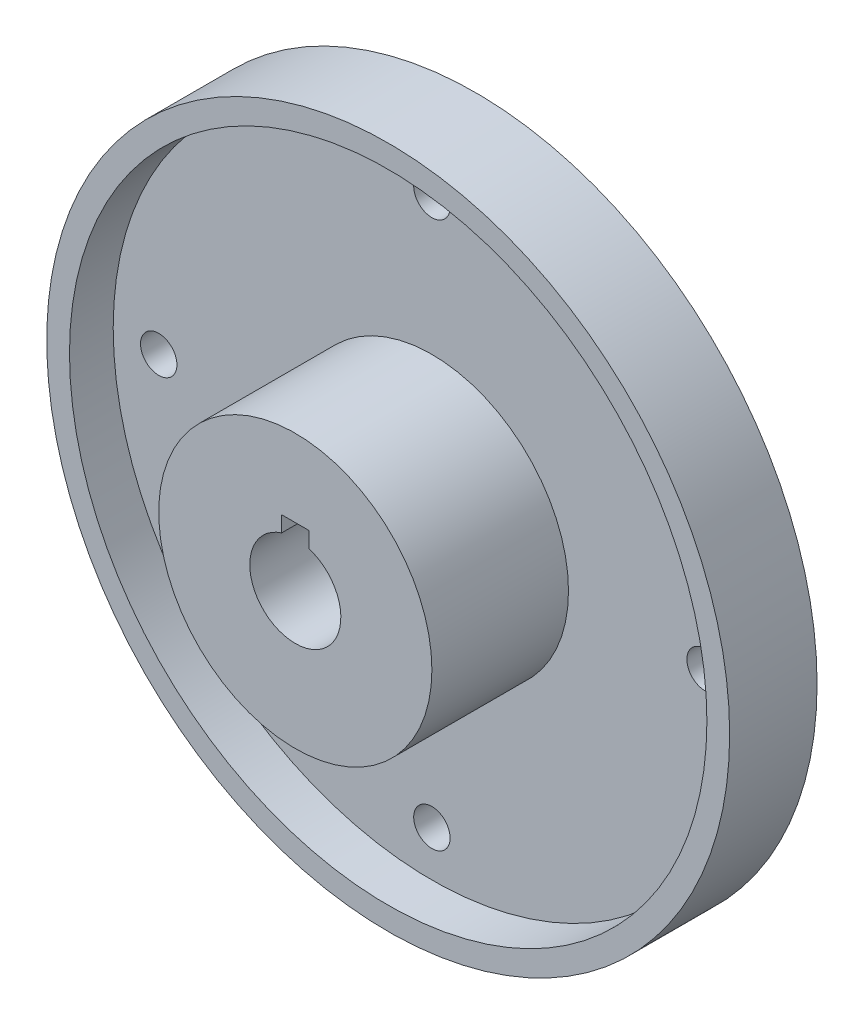
ISO-10303-21;
HEADER;
FILE_DESCRIPTION(('STEP AP214'),'2;1');
FILE_NAME('part.step','',(''),(''),'','','');
FILE_SCHEMA(('AUTOMOTIVE_DESIGN { 1 0 10303 214 1 1 1 1 }'));
ENDSEC;
DATA;
#1=APPLICATION_CONTEXT('core data for automotive mechanical design processes');
#2=APPLICATION_PROTOCOL_DEFINITION('international standard','automotive_design',2000,#1);
#3=PRODUCT_CONTEXT('',#1,'mechanical');
#4=PRODUCT('Part','Part','',(#3));
#5=PRODUCT_RELATED_PRODUCT_CATEGORY('part','',(#4));
#6=PRODUCT_DEFINITION_FORMATION('','',#4);
#7=PRODUCT_DEFINITION_CONTEXT('part definition',#1,'design');
#8=PRODUCT_DEFINITION('design','',#6,#7);
#9=PRODUCT_DEFINITION_SHAPE('','',#8);
#10=(LENGTH_UNIT() NAMED_UNIT(*) SI_UNIT(.MILLI.,.METRE.));
#11=(NAMED_UNIT(*) PLANE_ANGLE_UNIT() SI_UNIT($,.RADIAN.));
#12=(NAMED_UNIT(*) SI_UNIT($,.STERADIAN.) SOLID_ANGLE_UNIT());
#13=UNCERTAINTY_MEASURE_WITH_UNIT(LENGTH_MEASURE(1.E-05),#10,'distance_accuracy_value','');
#14=(GEOMETRIC_REPRESENTATION_CONTEXT(3) GLOBAL_UNCERTAINTY_ASSIGNED_CONTEXT((#13)) GLOBAL_UNIT_ASSIGNED_CONTEXT((#10,
#11,#12)) REPRESENTATION_CONTEXT('',''));
#15=CARTESIAN_POINT('',(0.,0.,0.));
#16=DIRECTION('',(0.,0.,1.));
#17=DIRECTION('',(1.,0.,0.));
#18=AXIS2_PLACEMENT_3D('',#15,#16,#17);
#19=CARTESIAN_POINT('',(0.,0.,19.2));
#20=DIRECTION('',(0.,0.,-1.));
#21=DIRECTION('',(-1.,0.,0.));
#22=AXIS2_PLACEMENT_3D('',#19,#20,#21);
#23=CYLINDRICAL_SURFACE('',#22,75.);
#24=CARTESIAN_POINT('',(0.,0.,19.2));
#25=DIRECTION('',(0.,0.,1.));
#26=DIRECTION('',(1.,0.,0.));
#27=AXIS2_PLACEMENT_3D('',#24,#25,#26);
#28=CIRCLE('',#27,75.);
#29=CARTESIAN_POINT('',(75.,0.,19.2));
#30=VERTEX_POINT('',#29);
#31=EDGE_CURVE('E177',#30,#30,#28,.T.);
#32=ORIENTED_EDGE('',*,*,#31,.F.);
#33=EDGE_LOOP('',(#32));
#34=FACE_BOUND('',#33,.T.);
#35=CARTESIAN_POINT('',(0.,0.,0.));
#36=DIRECTION('',(0.,0.,1.));
#37=DIRECTION('',(1.,0.,0.));
#38=AXIS2_PLACEMENT_3D('',#35,#36,#37);
#39=CIRCLE('',#38,75.);
#40=CARTESIAN_POINT('',(75.,0.,0.));
#41=VERTEX_POINT('',#40);
#42=EDGE_CURVE('E173',#41,#41,#39,.T.);
#43=ORIENTED_EDGE('',*,*,#42,.T.);
#44=EDGE_LOOP('',(#43));
#45=FACE_BOUND('',#44,.T.);
#46=ADVANCED_FACE('F45',(#34,#45),#23,.T.);
#47=CARTESIAN_POINT('',(0.,0.,19.2));
#48=DIRECTION('',(0.,0.,1.));
#49=DIRECTION('',(1.,0.,0.));
#50=AXIS2_PLACEMENT_3D('',#47,#48,#49);
#51=PLANE('',#50);
#52=CARTESIAN_POINT('',(0.,0.,19.2));
#53=DIRECTION('',(0.,0.,1.));
#54=DIRECTION('',(1.,0.,0.));
#55=AXIS2_PLACEMENT_3D('',#52,#53,#54);
#56=CIRCLE('',#55,70.);
#57=CARTESIAN_POINT('',(70.,0.,19.2));
#58=VERTEX_POINT('',#57);
#59=EDGE_CURVE('E165',#58,#58,#56,.T.);
#60=ORIENTED_EDGE('',*,*,#59,.F.);
#61=EDGE_LOOP('',(#60));
#62=FACE_BOUND('',#61,.T.);
#63=ORIENTED_EDGE('',*,*,#31,.T.);
#64=EDGE_LOOP('',(#63));
#65=FACE_BOUND('',#64,.T.);
#66=ADVANCED_FACE('F213',(#62,#65),#51,.T.);
#67=CARTESIAN_POINT('',(0.,0.,0.));
#68=DIRECTION('',(0.,0.,1.));
#69=DIRECTION('',(1.,0.,0.));
#70=AXIS2_PLACEMENT_3D('',#67,#68,#69);
#71=PLANE('',#70);
#72=CARTESIAN_POINT('',(0.,0.,0.));
#73=DIRECTION('',(0.,0.,1.));
#74=DIRECTION('',(1.,0.,0.));
#75=AXIS2_PLACEMENT_3D('',#72,#73,#74);
#76=CIRCLE('',#75,10.);
#77=CARTESIAN_POINT('',(-3.,9.53939201416946,0.));
#78=VERTEX_POINT('',#77);
#79=CARTESIAN_POINT('',(3.,9.53939201416946,0.));
#80=VERTEX_POINT('',#79);
#81=EDGE_CURVE('E107',#78,#80,#76,.T.);
#82=ORIENTED_EDGE('',*,*,#81,.T.);
#83=DIRECTION('',(0.,1.,0.));
#84=VECTOR('',#83,1.);
#85=CARTESIAN_POINT('',(3.,13.,0.));
#86=LINE('',#85,#84);
#87=CARTESIAN_POINT('',(3.,13.,0.));
#88=VERTEX_POINT('',#87);
#89=EDGE_CURVE('E87',#80,#88,#86,.T.);
#90=ORIENTED_EDGE('',*,*,#89,.T.);
#91=DIRECTION('',(-1.,0.,0.));
#92=VECTOR('',#91,1.);
#93=CARTESIAN_POINT('',(-3.,13.,0.));
#94=LINE('',#93,#92);
#95=CARTESIAN_POINT('',(-3.,13.,0.));
#96=VERTEX_POINT('',#95);
#97=EDGE_CURVE('E98',#88,#96,#94,.T.);
#98=ORIENTED_EDGE('',*,*,#97,.T.);
#99=DIRECTION('',(0.,-1.,0.));
#100=VECTOR('',#99,1.);
#101=CARTESIAN_POINT('',(-3.,13.,0.));
#102=LINE('',#101,#100);
#103=EDGE_CURVE('E95',#96,#78,#102,.T.);
#104=ORIENTED_EDGE('',*,*,#103,.T.);
#105=EDGE_LOOP('',(#82,#90,#98,#104));
#106=FACE_BOUND('',#105,.T.);
#107=CARTESIAN_POINT('',(0.,60.,0.));
#108=DIRECTION('',(0.,0.,1.));
#109=DIRECTION('',(1.,0.,0.));
#110=AXIS2_PLACEMENT_3D('',#107,#108,#109);
#111=CIRCLE('',#110,4.);
#112=CARTESIAN_POINT('',(4.,60.,0.));
#113=VERTEX_POINT('',#112);
#114=EDGE_CURVE('E150',#113,#113,#111,.T.);
#115=ORIENTED_EDGE('',*,*,#114,.T.);
#116=EDGE_LOOP('',(#115));
#117=FACE_BOUND('',#116,.T.);
#118=CARTESIAN_POINT('',(60.0000000000017,1.69428074463191E-12,0.));
#119=DIRECTION('',(0.,0.,1.));
#120=DIRECTION('',(1.,0.,0.));
#121=AXIS2_PLACEMENT_3D('',#118,#119,#120);
#122=CIRCLE('',#121,4.00000000000132);
#123=CARTESIAN_POINT('',(64.000000000003,1.69428074463191E-12,0.));
#124=VERTEX_POINT('',#123);
#125=EDGE_CURVE('E146',#124,#124,#122,.T.);
#126=ORIENTED_EDGE('',*,*,#125,.T.);
#127=EDGE_LOOP('',(#126));
#128=FACE_BOUND('',#127,.T.);
#129=CARTESIAN_POINT('',(3.38856148926383E-12,-60.,0.));
#130=DIRECTION('',(0.,0.,1.));
#131=DIRECTION('',(1.,0.,0.));
#132=AXIS2_PLACEMENT_3D('',#129,#130,#131);
#133=CIRCLE('',#132,4.00000000000364);
#134=CARTESIAN_POINT('',(4.00000000000703,-60.,0.));
#135=VERTEX_POINT('',#134);
#136=EDGE_CURVE('E142',#135,#135,#133,.T.);
#137=ORIENTED_EDGE('',*,*,#136,.T.);
#138=EDGE_LOOP('',(#137));
#139=FACE_BOUND('',#138,.T.);
#140=CARTESIAN_POINT('',(-59.9999999999983,-1.7016286254268E-12,0.));
#141=DIRECTION('',(0.,0.,1.));
#142=DIRECTION('',(1.,0.,0.));
#143=AXIS2_PLACEMENT_3D('',#140,#141,#142);
#144=CIRCLE('',#143,4.00000000000272);
#145=CARTESIAN_POINT('',(-55.9999999999956,-1.7016286254268E-12,0.));
#146=VERTEX_POINT('',#145);
#147=EDGE_CURVE('E127',#146,#146,#144,.T.);
#148=ORIENTED_EDGE('',*,*,#147,.T.);
#149=EDGE_LOOP('',(#148));
#150=FACE_BOUND('',#149,.T.);
#151=ORIENTED_EDGE('',*,*,#42,.F.);
#152=EDGE_LOOP('',(#151));
#153=FACE_BOUND('',#152,.T.);
#154=ADVANCED_FACE('F104',(#106,#117,#128,#139,#150,#153),#71,.F.);
#155=CARTESIAN_POINT('',(0.,0.,9.6));
#156=DIRECTION('',(0.,0.,1.));
#157=DIRECTION('',(1.,0.,0.));
#158=AXIS2_PLACEMENT_3D('',#155,#156,#157);
#159=CYLINDRICAL_SURFACE('',#158,70.);
#160=CARTESIAN_POINT('',(0.,0.,9.6));
#161=DIRECTION('',(0.,0.,1.));
#162=DIRECTION('',(1.,0.,0.));
#163=AXIS2_PLACEMENT_3D('',#160,#161,#162);
#164=CIRCLE('',#163,70.);
#165=CARTESIAN_POINT('',(70.,0.,9.6));
#166=VERTEX_POINT('',#165);
#167=EDGE_CURVE('E169',#166,#166,#164,.T.);
#168=ORIENTED_EDGE('',*,*,#167,.F.);
#169=EDGE_LOOP('',(#168));
#170=FACE_BOUND('',#169,.T.);
#171=ORIENTED_EDGE('',*,*,#59,.T.);
#172=EDGE_LOOP('',(#171));
#173=FACE_BOUND('',#172,.T.);
#174=ADVANCED_FACE('F203',(#170,#173),#159,.F.);
#175=CARTESIAN_POINT('',(0.,0.,9.6));
#176=DIRECTION('',(0.,0.,1.));
#177=DIRECTION('',(1.,0.,0.));
#178=AXIS2_PLACEMENT_3D('',#175,#176,#177);
#179=PLANE('',#178);
#180=CARTESIAN_POINT('',(0.,60.,9.6));
#181=DIRECTION('',(0.,0.,1.));
#182=DIRECTION('',(1.,0.,0.));
#183=AXIS2_PLACEMENT_3D('',#180,#181,#182);
#184=CIRCLE('',#183,4.);
#185=CARTESIAN_POINT('',(4.,60.,9.6));
#186=VERTEX_POINT('',#185);
#187=EDGE_CURVE('E123',#186,#186,#184,.T.);
#188=ORIENTED_EDGE('',*,*,#187,.F.);
#189=EDGE_LOOP('',(#188));
#190=FACE_BOUND('',#189,.T.);
#191=CARTESIAN_POINT('',(60.0000000000017,1.69428074463191E-12,9.6));
#192=DIRECTION('',(0.,0.,1.));
#193=DIRECTION('',(1.,0.,0.));
#194=AXIS2_PLACEMENT_3D('',#191,#192,#193);
#195=CIRCLE('',#194,4.00000000000132);
#196=CARTESIAN_POINT('',(64.000000000003,1.69428074463191E-12,9.6));
#197=VERTEX_POINT('',#196);
#198=EDGE_CURVE('E128',#197,#197,#195,.T.);
#199=ORIENTED_EDGE('',*,*,#198,.F.);
#200=EDGE_LOOP('',(#199));
#201=FACE_BOUND('',#200,.T.);
#202=CARTESIAN_POINT('',(3.38856148926383E-12,-60.,9.6));
#203=DIRECTION('',(0.,0.,1.));
#204=DIRECTION('',(1.,0.,0.));
#205=AXIS2_PLACEMENT_3D('',#202,#203,#204);
#206=CIRCLE('',#205,4.00000000000364);
#207=CARTESIAN_POINT('',(4.00000000000703,-60.,9.6));
#208=VERTEX_POINT('',#207);
#209=EDGE_CURVE('E132',#208,#208,#206,.T.);
#210=ORIENTED_EDGE('',*,*,#209,.F.);
#211=EDGE_LOOP('',(#210));
#212=FACE_BOUND('',#211,.T.);
#213=CARTESIAN_POINT('',(-59.9999999999983,-1.7016286254268E-12,9.6));
#214=DIRECTION('',(0.,0.,1.));
#215=DIRECTION('',(1.,0.,0.));
#216=AXIS2_PLACEMENT_3D('',#213,#214,#215);
#217=CIRCLE('',#216,4.00000000000272);
#218=CARTESIAN_POINT('',(-55.9999999999956,-1.7016286254268E-12,9.6));
#219=VERTEX_POINT('',#218);
#220=EDGE_CURVE('E121',#219,#219,#217,.T.);
#221=ORIENTED_EDGE('',*,*,#220,.F.);
#222=EDGE_LOOP('',(#221));
#223=FACE_BOUND('',#222,.T.);
#224=CARTESIAN_POINT('',(0.,0.,9.6));
#225=DIRECTION('',(0.,0.,1.));
#226=DIRECTION('',(1.,0.,0.));
#227=AXIS2_PLACEMENT_3D('',#224,#225,#226);
#228=CIRCLE('',#227,30.);
#229=CARTESIAN_POINT('',(30.,0.,9.6));
#230=VERTEX_POINT('',#229);
#231=EDGE_CURVE('E160',#230,#230,#228,.T.);
#232=ORIENTED_EDGE('',*,*,#231,.F.);
#233=EDGE_LOOP('',(#232));
#234=FACE_BOUND('',#233,.T.);
#235=ORIENTED_EDGE('',*,*,#167,.T.);
#236=EDGE_LOOP('',(#235));
#237=FACE_BOUND('',#236,.T.);
#238=ADVANCED_FACE('F197',(#190,#201,#212,#223,#234,#237),#179,.T.);
#239=CARTESIAN_POINT('',(0.,0.,39.6));
#240=DIRECTION('',(0.,0.,-1.));
#241=DIRECTION('',(-1.,0.,0.));
#242=AXIS2_PLACEMENT_3D('',#239,#240,#241);
#243=CYLINDRICAL_SURFACE('',#242,30.);
#244=CARTESIAN_POINT('',(0.,0.,39.6));
#245=DIRECTION('',(0.,0.,1.));
#246=DIRECTION('',(1.,0.,0.));
#247=AXIS2_PLACEMENT_3D('',#244,#245,#246);
#248=CIRCLE('',#247,30.);
#249=CARTESIAN_POINT('',(30.,0.,39.6));
#250=VERTEX_POINT('',#249);
#251=EDGE_CURVE('E161',#250,#250,#248,.T.);
#252=ORIENTED_EDGE('',*,*,#251,.F.);
#253=EDGE_LOOP('',(#252));
#254=FACE_BOUND('',#253,.T.);
#255=ORIENTED_EDGE('',*,*,#231,.T.);
#256=EDGE_LOOP('',(#255));
#257=FACE_BOUND('',#256,.T.);
#258=ADVANCED_FACE('F191',(#254,#257),#243,.T.);
#259=CARTESIAN_POINT('',(0.,0.,39.6));
#260=DIRECTION('',(0.,0.,1.));
#261=DIRECTION('',(1.,0.,0.));
#262=AXIS2_PLACEMENT_3D('',#259,#260,#261);
#263=PLANE('',#262);
#264=DIRECTION('',(0.,1.,0.));
#265=VECTOR('',#264,1.);
#266=CARTESIAN_POINT('',(3.,13.,39.6));
#267=LINE('',#266,#265);
#268=CARTESIAN_POINT('',(3.,9.53939201416946,39.6));
#269=VERTEX_POINT('',#268);
#270=CARTESIAN_POINT('',(3.,13.,39.6));
#271=VERTEX_POINT('',#270);
#272=EDGE_CURVE('E89',#269,#271,#267,.T.);
#273=ORIENTED_EDGE('',*,*,#272,.F.);
#274=CARTESIAN_POINT('',(0.,0.,39.6));
#275=DIRECTION('',(0.,0.,1.));
#276=DIRECTION('',(1.,0.,0.));
#277=AXIS2_PLACEMENT_3D('',#274,#275,#276);
#278=CIRCLE('',#277,10.);
#279=CARTESIAN_POINT('',(-3.,9.53939201416946,39.6));
#280=VERTEX_POINT('',#279);
#281=EDGE_CURVE('E154',#280,#269,#278,.T.);
#282=ORIENTED_EDGE('',*,*,#281,.F.);
#283=DIRECTION('',(0.,-1.,0.));
#284=VECTOR('',#283,1.);
#285=CARTESIAN_POINT('',(-3.,13.,39.6));
#286=LINE('',#285,#284);
#287=CARTESIAN_POINT('',(-3.,13.,39.6));
#288=VERTEX_POINT('',#287);
#289=EDGE_CURVE('E60',#288,#280,#286,.T.);
#290=ORIENTED_EDGE('',*,*,#289,.F.);
#291=DIRECTION('',(-1.,0.,0.));
#292=VECTOR('',#291,1.);
#293=CARTESIAN_POINT('',(-3.,13.,39.6));
#294=LINE('',#293,#292);
#295=EDGE_CURVE('E111',#271,#288,#294,.T.);
#296=ORIENTED_EDGE('',*,*,#295,.F.);
#297=EDGE_LOOP('',(#273,#282,#290,#296));
#298=FACE_BOUND('',#297,.T.);
#299=ORIENTED_EDGE('',*,*,#251,.T.);
#300=EDGE_LOOP('',(#299));
#301=FACE_BOUND('',#300,.T.);
#302=ADVANCED_FACE('F188',(#298,#301),#263,.T.);
#303=CARTESIAN_POINT('',(0.,0.,-17.4));
#304=DIRECTION('',(0.,0.,1.));
#305=DIRECTION('',(1.,0.,0.));
#306=AXIS2_PLACEMENT_3D('',#303,#304,#305);
#307=CYLINDRICAL_SURFACE('',#306,10.);
#308=ORIENTED_EDGE('',*,*,#281,.T.);
#309=DIRECTION('',(0.,0.,1.));
#310=VECTOR('',#309,1.);
#311=CARTESIAN_POINT('',(3.,9.53939201416946,-17.4));
#312=LINE('',#311,#310);
#313=EDGE_CURVE('E11',#269,#80,#312,.F.);
#314=ORIENTED_EDGE('',*,*,#313,.T.);
#315=ORIENTED_EDGE('',*,*,#81,.F.);
#316=DIRECTION('',(0.,0.,1.));
#317=VECTOR('',#316,1.);
#318=CARTESIAN_POINT('',(-3.,9.53939201416946,-17.4));
#319=LINE('',#318,#317);
#320=EDGE_CURVE('E53',#78,#280,#319,.T.);
#321=ORIENTED_EDGE('',*,*,#320,.T.);
#322=EDGE_LOOP('',(#308,#314,#315,#321));
#323=FACE_BOUND('',#322,.T.);
#324=ADVANCED_FACE('F186',(#323),#307,.F.);
#325=CARTESIAN_POINT('',(-59.9999999999983,-1.7016286254268E-12,-47.4));
#326=DIRECTION('',(0.,0.,1.));
#327=DIRECTION('',(1.,0.,0.));
#328=AXIS2_PLACEMENT_3D('',#325,#326,#327);
#329=CYLINDRICAL_SURFACE('',#328,4.00000000000272);
#330=ORIENTED_EDGE('',*,*,#220,.T.);
#331=EDGE_LOOP('',(#330));
#332=FACE_BOUND('',#331,.T.);
#333=ORIENTED_EDGE('',*,*,#147,.F.);
#334=EDGE_LOOP('',(#333));
#335=FACE_BOUND('',#334,.T.);
#336=ADVANCED_FACE('F230',(#332,#335),#329,.F.);
#337=CARTESIAN_POINT('',(3.38856148926383E-12,-60.,-47.4));
#338=DIRECTION('',(0.,0.,1.));
#339=DIRECTION('',(1.,0.,0.));
#340=AXIS2_PLACEMENT_3D('',#337,#338,#339);
#341=CYLINDRICAL_SURFACE('',#340,4.00000000000364);
#342=ORIENTED_EDGE('',*,*,#209,.T.);
#343=EDGE_LOOP('',(#342));
#344=FACE_BOUND('',#343,.T.);
#345=ORIENTED_EDGE('',*,*,#136,.F.);
#346=EDGE_LOOP('',(#345));
#347=FACE_BOUND('',#346,.T.);
#348=ADVANCED_FACE('F233',(#344,#347),#341,.F.);
#349=CARTESIAN_POINT('',(60.0000000000017,1.69428074463191E-12,-47.4));
#350=DIRECTION('',(0.,0.,1.));
#351=DIRECTION('',(1.,0.,0.));
#352=AXIS2_PLACEMENT_3D('',#349,#350,#351);
#353=CYLINDRICAL_SURFACE('',#352,4.00000000000132);
#354=ORIENTED_EDGE('',*,*,#198,.T.);
#355=EDGE_LOOP('',(#354));
#356=FACE_BOUND('',#355,.T.);
#357=ORIENTED_EDGE('',*,*,#125,.F.);
#358=EDGE_LOOP('',(#357));
#359=FACE_BOUND('',#358,.T.);
#360=ADVANCED_FACE('F237',(#356,#359),#353,.F.);
#361=CARTESIAN_POINT('',(0.,60.,-47.4));
#362=DIRECTION('',(0.,0.,1.));
#363=DIRECTION('',(1.,0.,0.));
#364=AXIS2_PLACEMENT_3D('',#361,#362,#363);
#365=CYLINDRICAL_SURFACE('',#364,4.);
#366=ORIENTED_EDGE('',*,*,#187,.T.);
#367=EDGE_LOOP('',(#366));
#368=FACE_BOUND('',#367,.T.);
#369=ORIENTED_EDGE('',*,*,#114,.F.);
#370=EDGE_LOOP('',(#369));
#371=FACE_BOUND('',#370,.T.);
#372=ADVANCED_FACE('F241',(#368,#371),#365,.F.);
#373=CARTESIAN_POINT('',(3.,13.,0.));
#374=DIRECTION('',(1.,0.,0.));
#375=DIRECTION('',(0.,0.,-1.));
#376=AXIS2_PLACEMENT_3D('',#373,#374,#375);
#377=PLANE('',#376);
#378=ORIENTED_EDGE('',*,*,#272,.T.);
#379=DIRECTION('',(0.,0.,1.));
#380=VECTOR('',#379,1.);
#381=CARTESIAN_POINT('',(3.,13.,0.));
#382=LINE('',#381,#380);
#383=EDGE_CURVE('E83',#88,#271,#382,.T.);
#384=ORIENTED_EDGE('',*,*,#383,.F.);
#385=ORIENTED_EDGE('',*,*,#89,.F.);
#386=ORIENTED_EDGE('',*,*,#313,.F.);
#387=EDGE_LOOP('',(#378,#384,#385,#386));
#388=FACE_BOUND('',#387,.T.);
#389=ADVANCED_FACE('F85',(#388),#377,.F.);
#390=CARTESIAN_POINT('',(-3.,13.,0.));
#391=DIRECTION('',(-1.,0.,0.));
#392=DIRECTION('',(0.,-1.,0.));
#393=AXIS2_PLACEMENT_3D('',#390,#391,#392);
#394=PLANE('',#393);
#395=ORIENTED_EDGE('',*,*,#103,.F.);
#396=DIRECTION('',(0.,0.,1.));
#397=VECTOR('',#396,1.);
#398=CARTESIAN_POINT('',(-3.,13.,0.));
#399=LINE('',#398,#397);
#400=EDGE_CURVE('E94',#96,#288,#399,.T.);
#401=ORIENTED_EDGE('',*,*,#400,.T.);
#402=ORIENTED_EDGE('',*,*,#289,.T.);
#403=ORIENTED_EDGE('',*,*,#320,.F.);
#404=EDGE_LOOP('',(#395,#401,#402,#403));
#405=FACE_BOUND('',#404,.T.);
#406=ADVANCED_FACE('F247',(#405),#394,.F.);
#407=CARTESIAN_POINT('',(-3.,13.,0.));
#408=DIRECTION('',(0.,1.,0.));
#409=DIRECTION('',(0.,0.,1.));
#410=AXIS2_PLACEMENT_3D('',#407,#408,#409);
#411=PLANE('',#410);
#412=ORIENTED_EDGE('',*,*,#295,.T.);
#413=ORIENTED_EDGE('',*,*,#400,.F.);
#414=ORIENTED_EDGE('',*,*,#97,.F.);
#415=ORIENTED_EDGE('',*,*,#383,.T.);
#416=EDGE_LOOP('',(#412,#413,#414,#415));
#417=FACE_BOUND('',#416,.T.);
#418=ADVANCED_FACE('F99',(#417),#411,.F.);
#419=CLOSED_SHELL('',(#46,#66,#154,#174,#238,#258,#302,#324,#336,#348,#360,#372,#389,#406,#418));
#420=MANIFOLD_SOLID_BREP('B2',#419);
#421=ADVANCED_BREP_SHAPE_REPRESENTATION('',(#18,#420),#14);
#422=SHAPE_DEFINITION_REPRESENTATION(#9,#421);
ENDSEC;
END-ISO-10303-21;
